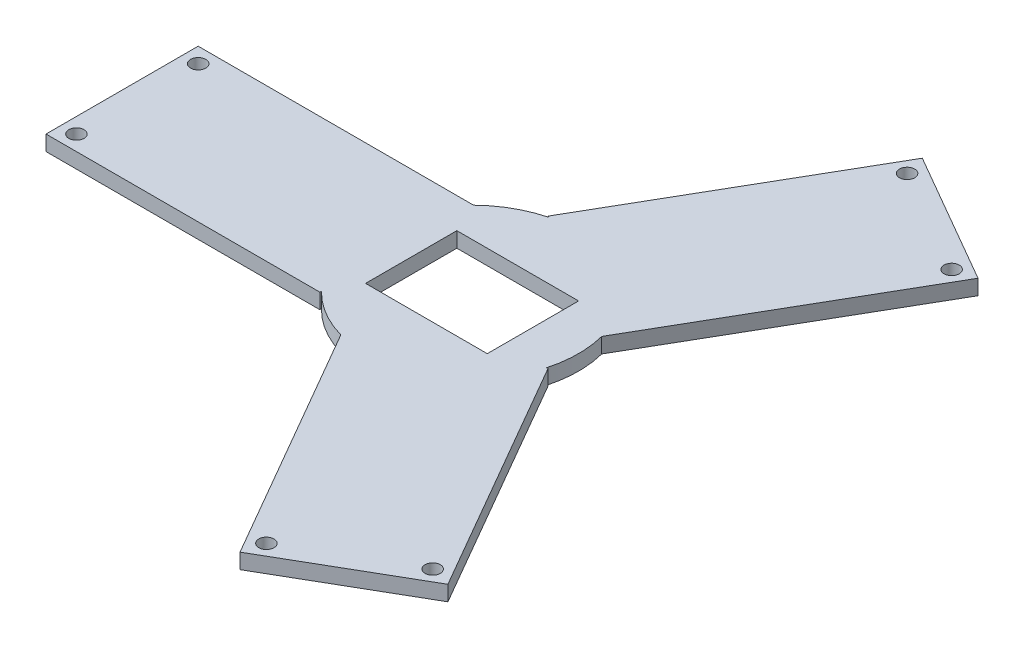
ISO-10303-21;
HEADER;
FILE_DESCRIPTION(('STEP AP214'),'2;1');
FILE_NAME('part.step','',(''),(''),'','','');
FILE_SCHEMA(('AUTOMOTIVE_DESIGN { 1 0 10303 214 1 1 1 1 }'));
ENDSEC;
DATA;
#1=APPLICATION_CONTEXT('core data for automotive mechanical design processes');
#2=APPLICATION_PROTOCOL_DEFINITION('international standard','automotive_design',2000,#1);
#3=PRODUCT_CONTEXT('',#1,'mechanical');
#4=PRODUCT('Part','Part','',(#3));
#5=PRODUCT_RELATED_PRODUCT_CATEGORY('part','',(#4));
#6=PRODUCT_DEFINITION_FORMATION('','',#4);
#7=PRODUCT_DEFINITION_CONTEXT('part definition',#1,'design');
#8=PRODUCT_DEFINITION('design','',#6,#7);
#9=PRODUCT_DEFINITION_SHAPE('','',#8);
#10=(LENGTH_UNIT() NAMED_UNIT(*) SI_UNIT(.MILLI.,.METRE.));
#11=(NAMED_UNIT(*) PLANE_ANGLE_UNIT() SI_UNIT($,.RADIAN.));
#12=(NAMED_UNIT(*) SI_UNIT($,.STERADIAN.) SOLID_ANGLE_UNIT());
#13=UNCERTAINTY_MEASURE_WITH_UNIT(LENGTH_MEASURE(1.E-05),#10,'distance_accuracy_value','');
#14=(GEOMETRIC_REPRESENTATION_CONTEXT(3) GLOBAL_UNCERTAINTY_ASSIGNED_CONTEXT((#13)) GLOBAL_UNIT_ASSIGNED_CONTEXT((#10,
#11,#12)) REPRESENTATION_CONTEXT('',''));
#15=CARTESIAN_POINT('',(0.,0.,0.));
#16=DIRECTION('',(0.,0.,1.));
#17=DIRECTION('',(1.,0.,0.));
#18=AXIS2_PLACEMENT_3D('',#15,#16,#17);
#19=CARTESIAN_POINT('',(-110.,5.,-20.000000000055));
#20=DIRECTION('',(0.,-1.,0.));
#21=DIRECTION('',(0.,0.,-1.));
#22=AXIS2_PLACEMENT_3D('',#19,#20,#21);
#23=CYLINDRICAL_SURFACE('',#22,2.5);
#24=CARTESIAN_POINT('',(-110.,5.,-20.000000000055));
#25=DIRECTION('',(0.,1.,0.));
#26=DIRECTION('',(0.,0.,1.));
#27=AXIS2_PLACEMENT_3D('',#24,#25,#26);
#28=CIRCLE('',#27,2.5);
#29=CARTESIAN_POINT('',(-110.,5.,-17.500000000055));
#30=VERTEX_POINT('',#29);
#31=EDGE_CURVE('E393',#30,#30,#28,.F.);
#32=ORIENTED_EDGE('',*,*,#31,.F.);
#33=EDGE_LOOP('',(#32));
#34=FACE_BOUND('',#33,.T.);
#35=CARTESIAN_POINT('',(-110.,0.,-20.000000000055));
#36=DIRECTION('',(0.,1.,0.));
#37=DIRECTION('',(0.,0.,1.));
#38=AXIS2_PLACEMENT_3D('',#35,#36,#37);
#39=CIRCLE('',#38,2.5);
#40=CARTESIAN_POINT('',(-110.,0.,-17.500000000055));
#41=VERTEX_POINT('',#40);
#42=EDGE_CURVE('E377',#41,#41,#39,.F.);
#43=ORIENTED_EDGE('',*,*,#42,.T.);
#44=EDGE_LOOP('',(#43));
#45=FACE_BOUND('',#44,.T.);
#46=ADVANCED_FACE('F190',(#34,#45),#23,.F.);
#47=CARTESIAN_POINT('',(-110.,5.,20.000000000055));
#48=DIRECTION('',(0.,-1.,0.));
#49=DIRECTION('',(0.,0.,-1.));
#50=AXIS2_PLACEMENT_3D('',#47,#48,#49);
#51=CYLINDRICAL_SURFACE('',#50,2.5);
#52=CARTESIAN_POINT('',(-110.,5.,20.000000000055));
#53=DIRECTION('',(0.,1.,0.));
#54=DIRECTION('',(0.,0.,1.));
#55=AXIS2_PLACEMENT_3D('',#52,#53,#54);
#56=CIRCLE('',#55,2.5);
#57=CARTESIAN_POINT('',(-110.,5.,22.500000000055));
#58=VERTEX_POINT('',#57);
#59=EDGE_CURVE('E389',#58,#58,#56,.T.);
#60=ORIENTED_EDGE('',*,*,#59,.T.);
#61=EDGE_LOOP('',(#60));
#62=FACE_BOUND('',#61,.T.);
#63=CARTESIAN_POINT('',(-110.,0.,20.000000000055));
#64=DIRECTION('',(0.,1.,0.));
#65=DIRECTION('',(0.,0.,1.));
#66=AXIS2_PLACEMENT_3D('',#63,#64,#65);
#67=CIRCLE('',#66,2.5);
#68=CARTESIAN_POINT('',(-110.,0.,22.500000000055));
#69=VERTEX_POINT('',#68);
#70=EDGE_CURVE('E415',#69,#69,#67,.T.);
#71=ORIENTED_EDGE('',*,*,#70,.F.);
#72=EDGE_LOOP('',(#71));
#73=FACE_BOUND('',#72,.T.);
#74=ADVANCED_FACE('F635',(#62,#73),#51,.F.);
#75=CARTESIAN_POINT('',(0.,5.,-24.9999999999607));
#76=DIRECTION('',(0.,0.,-1.));
#77=DIRECTION('',(-1.,0.,0.));
#78=AXIS2_PLACEMENT_3D('',#75,#76,#77);
#79=PLANE('',#78);
#80=DIRECTION('',(1.,0.,0.));
#81=VECTOR('',#80,1.);
#82=CARTESIAN_POINT('',(0.,0.,-24.9999999999607));
#83=LINE('',#82,#81);
#84=CARTESIAN_POINT('',(-115.,0.,-24.9999999999607));
#85=VERTEX_POINT('',#84);
#86=CARTESIAN_POINT('',(-24.4948974278719,0.,-24.9999999999607));
#87=VERTEX_POINT('',#86);
#88=EDGE_CURVE('E398',#85,#87,#83,.T.);
#89=ORIENTED_EDGE('',*,*,#88,.F.);
#90=DIRECTION('',(0.,-1.,0.));
#91=VECTOR('',#90,1.);
#92=CARTESIAN_POINT('',(-115.,5.,-24.9999999999607));
#93=LINE('',#92,#91);
#94=CARTESIAN_POINT('',(-115.,5.,-24.9999999999607));
#95=VERTEX_POINT('',#94);
#96=EDGE_CURVE('E200',#95,#85,#93,.T.);
#97=ORIENTED_EDGE('',*,*,#96,.F.);
#98=DIRECTION('',(1.,0.,0.));
#99=VECTOR('',#98,1.);
#100=CARTESIAN_POINT('',(0.,5.,-24.9999999999607));
#101=LINE('',#100,#99);
#102=CARTESIAN_POINT('',(-24.4948974278719,5.,-24.9999999999607));
#103=VERTEX_POINT('',#102);
#104=EDGE_CURVE('E372',#95,#103,#101,.T.);
#105=ORIENTED_EDGE('',*,*,#104,.T.);
#106=DIRECTION('',(0.,-1.,0.));
#107=VECTOR('',#106,1.);
#108=CARTESIAN_POINT('',(-24.4948974278719,5.,-24.9999999999607));
#109=LINE('',#108,#107);
#110=EDGE_CURVE('E12',#103,#87,#109,.T.);
#111=ORIENTED_EDGE('',*,*,#110,.T.);
#112=EDGE_LOOP('',(#89,#97,#105,#111));
#113=FACE_BOUND('',#112,.T.);
#114=ADVANCED_FACE('F632',(#113),#79,.T.);
#115=CARTESIAN_POINT('',(-115.,5.,0.));
#116=DIRECTION('',(-1.,0.,0.));
#117=DIRECTION('',(0.,0.,1.));
#118=AXIS2_PLACEMENT_3D('',#115,#116,#117);
#119=PLANE('',#118);
#120=DIRECTION('',(0.,0.,-1.));
#121=VECTOR('',#120,1.);
#122=CARTESIAN_POINT('',(-115.,0.,0.));
#123=LINE('',#122,#121);
#124=CARTESIAN_POINT('',(-115.,0.,25.000000000055));
#125=VERTEX_POINT('',#124);
#126=EDGE_CURVE('E402',#125,#85,#123,.T.);
#127=ORIENTED_EDGE('',*,*,#126,.F.);
#128=DIRECTION('',(0.,-1.,0.));
#129=VECTOR('',#128,1.);
#130=CARTESIAN_POINT('',(-115.,5.,25.000000000055));
#131=LINE('',#130,#129);
#132=CARTESIAN_POINT('',(-115.,5.,25.000000000055));
#133=VERTEX_POINT('',#132);
#134=EDGE_CURVE('E427',#133,#125,#131,.T.);
#135=ORIENTED_EDGE('',*,*,#134,.F.);
#136=DIRECTION('',(0.,0.,-1.));
#137=VECTOR('',#136,1.);
#138=CARTESIAN_POINT('',(-115.,5.,0.));
#139=LINE('',#138,#137);
#140=EDGE_CURVE('E376',#133,#95,#139,.T.);
#141=ORIENTED_EDGE('',*,*,#140,.T.);
#142=ORIENTED_EDGE('',*,*,#96,.T.);
#143=EDGE_LOOP('',(#127,#135,#141,#142));
#144=FACE_BOUND('',#143,.T.);
#145=ADVANCED_FACE('F629',(#144),#119,.T.);
#146=CARTESIAN_POINT('',(0.,5.,25.000000000055));
#147=DIRECTION('',(0.,0.,1.));
#148=DIRECTION('',(1.,0.,0.));
#149=AXIS2_PLACEMENT_3D('',#146,#147,#148);
#150=PLANE('',#149);
#151=DIRECTION('',(-1.,0.,0.));
#152=VECTOR('',#151,1.);
#153=CARTESIAN_POINT('',(0.,0.,25.000000000055));
#154=LINE('',#153,#152);
#155=CARTESIAN_POINT('',(-25.,0.,25.000000000055));
#156=VERTEX_POINT('',#155);
#157=EDGE_CURVE('E407',#156,#125,#154,.T.);
#158=ORIENTED_EDGE('',*,*,#157,.F.);
#159=DIRECTION('',(0.,-1.,0.));
#160=VECTOR('',#159,1.);
#161=CARTESIAN_POINT('',(-25.,5.,25.000000000055));
#162=LINE('',#161,#160);
#163=CARTESIAN_POINT('',(-25.,5.,25.000000000055));
#164=VERTEX_POINT('',#163);
#165=EDGE_CURVE('E424',#164,#156,#162,.T.);
#166=ORIENTED_EDGE('',*,*,#165,.F.);
#167=DIRECTION('',(-1.,0.,0.));
#168=VECTOR('',#167,1.);
#169=CARTESIAN_POINT('',(0.,5.,25.000000000055));
#170=LINE('',#169,#168);
#171=EDGE_CURVE('E381',#164,#133,#170,.T.);
#172=ORIENTED_EDGE('',*,*,#171,.T.);
#173=ORIENTED_EDGE('',*,*,#134,.T.);
#174=EDGE_LOOP('',(#158,#166,#172,#173));
#175=FACE_BOUND('',#174,.T.);
#176=ADVANCED_FACE('F624',(#175),#150,.T.);
#177=CARTESIAN_POINT('',(-24.744923458781,5.,-0.249974489722791));
#178=DIRECTION('',(0.99994897818343,0.,0.0101015360175433));
#179=DIRECTION('',(0.0101015360175433,0.,-0.99994897818343));
#180=AXIS2_PLACEMENT_3D('',#177,#178,#179);
#181=PLANE('',#180);
#182=DIRECTION('',(-0.0101015360175433,0.,0.99994897818343));
#183=VECTOR('',#182,1.);
#184=CARTESIAN_POINT('',(-24.744923458781,0.,-0.249974489722791));
#185=LINE('',#184,#183);
#186=CARTESIAN_POINT('',(-24.9949494896901,0.,24.5000510205151));
#187=VERTEX_POINT('',#186);
#188=EDGE_CURVE('E411',#187,#156,#185,.T.);
#189=ORIENTED_EDGE('',*,*,#188,.F.);
#190=DIRECTION('',(0.,-1.,0.));
#191=VECTOR('',#190,1.);
#192=CARTESIAN_POINT('',(-24.9949494896901,5.,24.5000510205151));
#193=LINE('',#192,#191);
#194=CARTESIAN_POINT('',(-24.9949494896901,5.,24.5000510205151));
#195=VERTEX_POINT('',#194);
#196=EDGE_CURVE('E397',#195,#187,#193,.T.);
#197=ORIENTED_EDGE('',*,*,#196,.F.);
#198=DIRECTION('',(-0.0101015360175433,0.,0.99994897818343));
#199=VECTOR('',#198,1.);
#200=CARTESIAN_POINT('',(-24.744923458781,5.,-0.249974489722791));
#201=LINE('',#200,#199);
#202=EDGE_CURVE('E385',#195,#164,#201,.T.);
#203=ORIENTED_EDGE('',*,*,#202,.T.);
#204=ORIENTED_EDGE('',*,*,#165,.T.);
#205=EDGE_LOOP('',(#189,#197,#203,#204));
#206=FACE_BOUND('',#205,.T.);
#207=ADVANCED_FACE('F621',(#206),#181,.T.);
#208=CARTESIAN_POINT('',(0.,0.,0.));
#209=DIRECTION('',(0.,1.,0.));
#210=DIRECTION('',(0.,0.,1.));
#211=AXIS2_PLACEMENT_3D('',#208,#209,#210);
#212=PLANE('',#211);
#213=DIRECTION('',(-1.,0.,0.));
#214=VECTOR('',#213,1.);
#215=CARTESIAN_POINT('',(20.,0.,-15.));
#216=LINE('',#215,#214);
#217=CARTESIAN_POINT('',(20.,0.,-15.));
#218=VERTEX_POINT('',#217);
#219=CARTESIAN_POINT('',(-20.,0.,-15.));
#220=VERTEX_POINT('',#219);
#221=EDGE_CURVE('E332',#218,#220,#216,.T.);
#222=ORIENTED_EDGE('',*,*,#221,.T.);
#223=DIRECTION('',(0.,0.,1.));
#224=VECTOR('',#223,1.);
#225=CARTESIAN_POINT('',(-20.,0.,15.));
#226=LINE('',#225,#224);
#227=CARTESIAN_POINT('',(-20.,0.,15.));
#228=VERTEX_POINT('',#227);
#229=EDGE_CURVE('E325',#220,#228,#226,.T.);
#230=ORIENTED_EDGE('',*,*,#229,.T.);
#231=DIRECTION('',(1.,0.,0.));
#232=VECTOR('',#231,1.);
#233=CARTESIAN_POINT('',(20.,0.,15.));
#234=LINE('',#233,#232);
#235=CARTESIAN_POINT('',(20.,0.,15.));
#236=VERTEX_POINT('',#235);
#237=EDGE_CURVE('E335',#228,#236,#234,.T.);
#238=ORIENTED_EDGE('',*,*,#237,.T.);
#239=DIRECTION('',(0.,0.,-1.));
#240=VECTOR('',#239,1.);
#241=CARTESIAN_POINT('',(20.,0.,15.));
#242=LINE('',#241,#240);
#243=EDGE_CURVE('E208',#236,#218,#242,.T.);
#244=ORIENTED_EDGE('',*,*,#243,.T.);
#245=EDGE_LOOP('',(#222,#230,#238,#244));
#246=FACE_BOUND('',#245,.T.);
#247=ORIENTED_EDGE('',*,*,#88,.T.);
#248=CARTESIAN_POINT('',(0.,0.,0.));
#249=DIRECTION('',(0.,1.,0.));
#250=DIRECTION('',(0.,0.,1.));
#251=AXIS2_PLACEMENT_3D('',#248,#249,#250);
#252=CIRCLE('',#251,35.);
#253=CARTESIAN_POINT('',(-8.72019183293593,0.,-33.896286734638));
#254=VERTEX_POINT('',#253);
#255=EDGE_CURVE('E529',#254,#87,#252,.T.);
#256=ORIENTED_EDGE('',*,*,#255,.F.);
#257=DIRECTION('',(0.86093044958637,0.,0.508722675900151));
#258=VECTOR('',#257,1.);
#259=CARTESIAN_POINT('',(12.5889459877885,0.,-21.3047450851444));
#260=LINE('',#259,#258);
#261=CARTESIAN_POINT('',(-9.15063509465858,0.,-34.1506350946385));
#262=VERTEX_POINT('',#261);
#263=EDGE_CURVE('E541',#262,#254,#260,.T.);
#264=ORIENTED_EDGE('',*,*,#263,.F.);
#265=DIRECTION('',(0.5,0.,-0.866025403784439));
#266=VECTOR('',#265,1.);
#267=CARTESIAN_POINT('',(-21.6506350946586,0.,-12.5000000000275));
#268=LINE('',#267,#266);
#269=CARTESIAN_POINT('',(35.8493649053414,0.,-112.092921435238));
#270=VERTEX_POINT('',#269);
#271=EDGE_CURVE('E537',#262,#270,#268,.T.);
#272=ORIENTED_EDGE('',*,*,#271,.T.);
#273=DIRECTION('',(0.866025403784439,0.,0.5));
#274=VECTOR('',#273,1.);
#275=CARTESIAN_POINT('',(57.5,0.,-99.5929214352105));
#276=LINE('',#275,#274);
#277=CARTESIAN_POINT('',(79.1506350945769,0.,-87.0929214352301));
#278=VERTEX_POINT('',#277);
#279=EDGE_CURVE('E533',#270,#278,#276,.T.);
#280=ORIENTED_EDGE('',*,*,#279,.T.);
#281=DIRECTION('',(0.5,0.,-0.866025403784439));
#282=VECTOR('',#281,1.);
#283=CARTESIAN_POINT('',(21.6506350945769,0.,12.4999999999803));
#284=LINE('',#283,#282);
#285=CARTESIAN_POINT('',(33.8980838085129,0.,-8.71320343565085));
#286=VERTEX_POINT('',#285);
#287=EDGE_CURVE('E527',#286,#278,#284,.T.);
#288=ORIENTED_EDGE('',*,*,#287,.F.);
#289=CARTESIAN_POINT('',(33.715141322626,0.,9.39623571412291));
#290=VERTEX_POINT('',#289);
#291=EDGE_CURVE('E366',#290,#286,#252,.T.);
#292=ORIENTED_EDGE('',*,*,#291,.F.);
#293=DIRECTION('',(0.871031985603914,0.,-0.49122630228328));
#294=VECTOR('',#293,1.);
#295=CARTESIAN_POINT('',(12.1559774709925,0.,21.5547195748672));
#296=LINE('',#295,#294);
#297=CARTESIAN_POINT('',(34.1506350946586,0.,9.15063509458348));
#298=VERTEX_POINT('',#297);
#299=EDGE_CURVE('E469',#290,#298,#296,.T.);
#300=ORIENTED_EDGE('',*,*,#299,.T.);
#301=DIRECTION('',(0.500000000000001,0.,0.866025403784438));
#302=VECTOR('',#301,1.);
#303=CARTESIAN_POINT('',(21.6506350946586,0.,-12.5000000000275));
#304=LINE('',#303,#302);
#305=CARTESIAN_POINT('',(79.1506350946587,0.,87.0929214351829));
#306=VERTEX_POINT('',#305);
#307=EDGE_CURVE('E465',#298,#306,#304,.T.);
#308=ORIENTED_EDGE('',*,*,#307,.T.);
#309=DIRECTION('',(-0.866025403784438,0.,0.5));
#310=VECTOR('',#309,1.);
#311=CARTESIAN_POINT('',(57.5000000000001,0.,99.5929214352104));
#312=LINE('',#311,#310);
#313=CARTESIAN_POINT('',(35.8493649054231,0.,112.092921435191));
#314=VERTEX_POINT('',#313);
#315=EDGE_CURVE('E461',#306,#314,#312,.T.);
#316=ORIENTED_EDGE('',*,*,#315,.T.);
#317=DIRECTION('',(0.5,0.,0.866025403784438));
#318=VECTOR('',#317,1.);
#319=CARTESIAN_POINT('',(-21.6506350945769,0.,12.4999999999803));
#320=LINE('',#319,#318);
#321=CARTESIAN_POINT('',(-9.40318638064095,0.,33.7132034356115));
#322=VERTEX_POINT('',#321);
#323=EDGE_CURVE('E457',#322,#314,#320,.T.);
#324=ORIENTED_EDGE('',*,*,#323,.F.);
#325=EDGE_CURVE('E528',#187,#322,#252,.T.);
#326=ORIENTED_EDGE('',*,*,#325,.F.);
#327=ORIENTED_EDGE('',*,*,#188,.T.);
#328=ORIENTED_EDGE('',*,*,#157,.T.);
#329=ORIENTED_EDGE('',*,*,#126,.T.);
#330=EDGE_LOOP('',(#247,#256,#264,#272,#280,#288,#292,#300,#308,#316,#324,#326,#327,#328,#329));
#331=FACE_BOUND('',#330,.T.);
#332=ORIENTED_EDGE('',*,*,#70,.T.);
#333=EDGE_LOOP('',(#332));
#334=FACE_BOUND('',#333,.T.);
#335=ORIENTED_EDGE('',*,*,#42,.F.);
#336=EDGE_LOOP('',(#335));
#337=FACE_BOUND('',#336,.T.);
#338=CARTESIAN_POINT('',(72.3205080757368,0.,-85.2627944162604));
#339=DIRECTION('',(0.,1.,0.));
#340=DIRECTION('',(0.,0.,1.));
#341=AXIS2_PLACEMENT_3D('',#338,#339,#340);
#342=CIRCLE('',#341,2.49999999999999);
#343=CARTESIAN_POINT('',(72.3205080757368,0.,-82.7627944162605));
#344=VERTEX_POINT('',#343);
#345=EDGE_CURVE('E498',#344,#344,#342,.F.);
#346=ORIENTED_EDGE('',*,*,#345,.F.);
#347=EDGE_LOOP('',(#346));
#348=FACE_BOUND('',#347,.T.);
#349=CARTESIAN_POINT('',(37.6794919242641,0.,-105.262794416316));
#350=DIRECTION('',(0.,1.,0.));
#351=DIRECTION('',(0.,0.,1.));
#352=AXIS2_PLACEMENT_3D('',#349,#350,#351);
#353=CIRCLE('',#352,2.5);
#354=CARTESIAN_POINT('',(37.6794919242641,0.,-102.762794416316));
#355=VERTEX_POINT('',#354);
#356=EDGE_CURVE('E545',#355,#355,#353,.T.);
#357=ORIENTED_EDGE('',*,*,#356,.T.);
#358=EDGE_LOOP('',(#357));
#359=FACE_BOUND('',#358,.T.);
#360=CARTESIAN_POINT('',(72.3205080757356,0.,85.2627944162614));
#361=DIRECTION('',(0.,1.,0.));
#362=DIRECTION('',(0.,0.,1.));
#363=AXIS2_PLACEMENT_3D('',#360,#361,#362);
#364=CIRCLE('',#363,2.49999999999999);
#365=CARTESIAN_POINT('',(72.3205080757356,0.,87.7627944162614));
#366=VERTEX_POINT('',#365);
#367=EDGE_CURVE('E473',#366,#366,#364,.T.);
#368=ORIENTED_EDGE('',*,*,#367,.T.);
#369=EDGE_LOOP('',(#368));
#370=FACE_BOUND('',#369,.T.);
#371=CARTESIAN_POINT('',(37.6794919242626,0.,105.262794416316));
#372=DIRECTION('',(0.,1.,0.));
#373=DIRECTION('',(0.,0.,1.));
#374=AXIS2_PLACEMENT_3D('',#371,#372,#373);
#375=CIRCLE('',#374,2.49999999999998);
#376=CARTESIAN_POINT('',(37.6794919242626,0.,107.762794416316));
#377=VERTEX_POINT('',#376);
#378=EDGE_CURVE('E436',#377,#377,#375,.F.);
#379=ORIENTED_EDGE('',*,*,#378,.F.);
#380=EDGE_LOOP('',(#379));
#381=FACE_BOUND('',#380,.T.);
#382=ADVANCED_FACE('F340',(#246,#331,#334,#337,#348,#359,#370,#381),#212,.F.);
#383=CARTESIAN_POINT('',(0.,5.,0.));
#384=DIRECTION('',(0.,1.,0.));
#385=DIRECTION('',(0.,0.,1.));
#386=AXIS2_PLACEMENT_3D('',#383,#384,#385);
#387=PLANE('',#386);
#388=DIRECTION('',(0.,0.,1.));
#389=VECTOR('',#388,1.);
#390=CARTESIAN_POINT('',(-20.,5.,15.));
#391=LINE('',#390,#389);
#392=CARTESIAN_POINT('',(-20.,5.,-15.));
#393=VERTEX_POINT('',#392);
#394=CARTESIAN_POINT('',(-20.,5.,15.));
#395=VERTEX_POINT('',#394);
#396=EDGE_CURVE('E216',#393,#395,#391,.T.);
#397=ORIENTED_EDGE('',*,*,#396,.F.);
#398=DIRECTION('',(-1.,0.,0.));
#399=VECTOR('',#398,1.);
#400=CARTESIAN_POINT('',(20.,5.,-15.));
#401=LINE('',#400,#399);
#402=CARTESIAN_POINT('',(20.,5.,-15.));
#403=VERTEX_POINT('',#402);
#404=EDGE_CURVE('E344',#403,#393,#401,.T.);
#405=ORIENTED_EDGE('',*,*,#404,.F.);
#406=DIRECTION('',(0.,0.,-1.));
#407=VECTOR('',#406,1.);
#408=CARTESIAN_POINT('',(20.,5.,15.));
#409=LINE('',#408,#407);
#410=CARTESIAN_POINT('',(20.,5.,15.));
#411=VERTEX_POINT('',#410);
#412=EDGE_CURVE('E348',#411,#403,#409,.T.);
#413=ORIENTED_EDGE('',*,*,#412,.F.);
#414=DIRECTION('',(1.,0.,0.));
#415=VECTOR('',#414,1.);
#416=CARTESIAN_POINT('',(20.,5.,15.));
#417=LINE('',#416,#415);
#418=EDGE_CURVE('E357',#395,#411,#417,.T.);
#419=ORIENTED_EDGE('',*,*,#418,.F.);
#420=EDGE_LOOP('',(#397,#405,#413,#419));
#421=FACE_BOUND('',#420,.T.);
#422=ORIENTED_EDGE('',*,*,#202,.F.);
#423=CARTESIAN_POINT('',(0.,5.,0.));
#424=DIRECTION('',(0.,1.,0.));
#425=DIRECTION('',(0.,0.,1.));
#426=AXIS2_PLACEMENT_3D('',#423,#424,#425);
#427=CIRCLE('',#426,35.);
#428=CARTESIAN_POINT('',(-9.40318638064095,5.,33.7132034356115));
#429=VERTEX_POINT('',#428);
#430=EDGE_CURVE('E499',#195,#429,#427,.T.);
#431=ORIENTED_EDGE('',*,*,#430,.T.);
#432=DIRECTION('',(0.5,0.,0.866025403784438));
#433=VECTOR('',#432,1.);
#434=CARTESIAN_POINT('',(-21.6506350945769,5.,12.4999999999803));
#435=LINE('',#434,#433);
#436=CARTESIAN_POINT('',(35.8493649054231,5.,112.092921435191));
#437=VERTEX_POINT('',#436);
#438=EDGE_CURVE('E432',#429,#437,#435,.T.);
#439=ORIENTED_EDGE('',*,*,#438,.T.);
#440=DIRECTION('',(-0.866025403784438,0.,0.5));
#441=VECTOR('',#440,1.);
#442=CARTESIAN_POINT('',(57.5000000000001,5.,99.5929214352104));
#443=LINE('',#442,#441);
#444=CARTESIAN_POINT('',(79.1506350946587,5.,87.0929214351829));
#445=VERTEX_POINT('',#444);
#446=EDGE_CURVE('E435',#445,#437,#443,.T.);
#447=ORIENTED_EDGE('',*,*,#446,.F.);
#448=DIRECTION('',(0.500000000000001,0.,0.866025403784438));
#449=VECTOR('',#448,1.);
#450=CARTESIAN_POINT('',(21.6506350946586,5.,-12.5000000000275));
#451=LINE('',#450,#449);
#452=CARTESIAN_POINT('',(34.1506350946586,5.,9.15063509458348));
#453=VERTEX_POINT('',#452);
#454=EDGE_CURVE('E440',#453,#445,#451,.T.);
#455=ORIENTED_EDGE('',*,*,#454,.F.);
#456=DIRECTION('',(0.871031985603914,0.,-0.49122630228328));
#457=VECTOR('',#456,1.);
#458=CARTESIAN_POINT('',(12.1559774709925,5.,21.5547195748672));
#459=LINE('',#458,#457);
#460=CARTESIAN_POINT('',(33.715141322626,5.,9.39623571412291));
#461=VERTEX_POINT('',#460);
#462=EDGE_CURVE('E444',#461,#453,#459,.T.);
#463=ORIENTED_EDGE('',*,*,#462,.F.);
#464=CARTESIAN_POINT('',(33.8980838085129,5.,-8.71320343565085));
#465=VERTEX_POINT('',#464);
#466=EDGE_CURVE('E493',#461,#465,#427,.T.);
#467=ORIENTED_EDGE('',*,*,#466,.T.);
#468=DIRECTION('',(0.5,0.,-0.866025403784439));
#469=VECTOR('',#468,1.);
#470=CARTESIAN_POINT('',(21.6506350945769,5.,12.4999999999803));
#471=LINE('',#470,#469);
#472=CARTESIAN_POINT('',(79.1506350945769,5.,-87.0929214352301));
#473=VERTEX_POINT('',#472);
#474=EDGE_CURVE('E497',#465,#473,#471,.T.);
#475=ORIENTED_EDGE('',*,*,#474,.T.);
#476=DIRECTION('',(0.866025403784439,0.,0.5));
#477=VECTOR('',#476,1.);
#478=CARTESIAN_POINT('',(57.5,5.,-99.5929214352105));
#479=LINE('',#478,#477);
#480=CARTESIAN_POINT('',(35.8493649053414,5.,-112.092921435238));
#481=VERTEX_POINT('',#480);
#482=EDGE_CURVE('E503',#481,#473,#479,.T.);
#483=ORIENTED_EDGE('',*,*,#482,.F.);
#484=DIRECTION('',(0.5,0.,-0.866025403784439));
#485=VECTOR('',#484,1.);
#486=CARTESIAN_POINT('',(-21.6506350946586,5.,-12.5000000000275));
#487=LINE('',#486,#485);
#488=CARTESIAN_POINT('',(-9.15063509465858,5.,-34.1506350946385));
#489=VERTEX_POINT('',#488);
#490=EDGE_CURVE('E507',#489,#481,#487,.T.);
#491=ORIENTED_EDGE('',*,*,#490,.F.);
#492=DIRECTION('',(0.86093044958637,0.,0.508722675900151));
#493=VECTOR('',#492,1.);
#494=CARTESIAN_POINT('',(12.5889459877885,5.,-21.3047450851444));
#495=LINE('',#494,#493);
#496=CARTESIAN_POINT('',(-8.72019183293593,5.,-33.896286734638));
#497=VERTEX_POINT('',#496);
#498=EDGE_CURVE('E511',#489,#497,#495,.T.);
#499=ORIENTED_EDGE('',*,*,#498,.T.);
#500=EDGE_CURVE('E500',#497,#103,#427,.T.);
#501=ORIENTED_EDGE('',*,*,#500,.T.);
#502=ORIENTED_EDGE('',*,*,#104,.F.);
#503=ORIENTED_EDGE('',*,*,#140,.F.);
#504=ORIENTED_EDGE('',*,*,#171,.F.);
#505=EDGE_LOOP('',(#422,#431,#439,#447,#455,#463,#467,#475,#483,#491,#499,#501,#502,#503,#504));
#506=FACE_BOUND('',#505,.T.);
#507=ORIENTED_EDGE('',*,*,#59,.F.);
#508=EDGE_LOOP('',(#507));
#509=FACE_BOUND('',#508,.T.);
#510=ORIENTED_EDGE('',*,*,#31,.T.);
#511=EDGE_LOOP('',(#510));
#512=FACE_BOUND('',#511,.T.);
#513=CARTESIAN_POINT('',(37.6794919242641,5.,-105.262794416316));
#514=DIRECTION('',(0.,1.,0.));
#515=DIRECTION('',(0.,0.,1.));
#516=AXIS2_PLACEMENT_3D('',#513,#514,#515);
#517=CIRCLE('',#516,2.5);
#518=CARTESIAN_POINT('',(37.6794919242641,5.,-102.762794416316));
#519=VERTEX_POINT('',#518);
#520=EDGE_CURVE('E515',#519,#519,#517,.T.);
#521=ORIENTED_EDGE('',*,*,#520,.F.);
#522=EDGE_LOOP('',(#521));
#523=FACE_BOUND('',#522,.T.);
#524=CARTESIAN_POINT('',(72.3205080757368,5.,-85.2627944162604));
#525=DIRECTION('',(0.,1.,0.));
#526=DIRECTION('',(0.,0.,1.));
#527=AXIS2_PLACEMENT_3D('',#524,#525,#526);
#528=CIRCLE('',#527,2.49999999999999);
#529=CARTESIAN_POINT('',(72.3205080757368,5.,-82.7627944162605));
#530=VERTEX_POINT('',#529);
#531=EDGE_CURVE('E519',#530,#530,#528,.F.);
#532=ORIENTED_EDGE('',*,*,#531,.T.);
#533=EDGE_LOOP('',(#532));
#534=FACE_BOUND('',#533,.T.);
#535=CARTESIAN_POINT('',(72.3205080757356,5.,85.2627944162614));
#536=DIRECTION('',(0.,1.,0.));
#537=DIRECTION('',(0.,0.,1.));
#538=AXIS2_PLACEMENT_3D('',#535,#536,#537);
#539=CIRCLE('',#538,2.49999999999999);
#540=CARTESIAN_POINT('',(72.3205080757356,5.,87.7627944162614));
#541=VERTEX_POINT('',#540);
#542=EDGE_CURVE('E448',#541,#541,#539,.T.);
#543=ORIENTED_EDGE('',*,*,#542,.F.);
#544=EDGE_LOOP('',(#543));
#545=FACE_BOUND('',#544,.T.);
#546=CARTESIAN_POINT('',(37.6794919242626,5.,105.262794416316));
#547=DIRECTION('',(0.,1.,0.));
#548=DIRECTION('',(0.,0.,1.));
#549=AXIS2_PLACEMENT_3D('',#546,#547,#548);
#550=CIRCLE('',#549,2.49999999999998);
#551=CARTESIAN_POINT('',(37.6794919242626,5.,107.762794416316));
#552=VERTEX_POINT('',#551);
#553=EDGE_CURVE('E452',#552,#552,#550,.F.);
#554=ORIENTED_EDGE('',*,*,#553,.T.);
#555=EDGE_LOOP('',(#554));
#556=FACE_BOUND('',#555,.T.);
#557=ADVANCED_FACE('F582',(#421,#506,#509,#512,#523,#534,#545,#556),#387,.T.);
#558=CARTESIAN_POINT('',(37.6794919242626,5.,105.262794416316));
#559=DIRECTION('',(0.,-1.,0.));
#560=DIRECTION('',(0.,0.,-1.));
#561=AXIS2_PLACEMENT_3D('',#558,#559,#560);
#562=CYLINDRICAL_SURFACE('',#561,2.49999999999998);
#563=ORIENTED_EDGE('',*,*,#553,.F.);
#564=EDGE_LOOP('',(#563));
#565=FACE_BOUND('',#564,.T.);
#566=ORIENTED_EDGE('',*,*,#378,.T.);
#567=EDGE_LOOP('',(#566));
#568=FACE_BOUND('',#567,.T.);
#569=ADVANCED_FACE('F683',(#565,#568),#562,.F.);
#570=CARTESIAN_POINT('',(72.3205080757356,5.,85.2627944162614));
#571=DIRECTION('',(0.,-1.,0.));
#572=DIRECTION('',(0.,0.,-1.));
#573=AXIS2_PLACEMENT_3D('',#570,#571,#572);
#574=CYLINDRICAL_SURFACE('',#573,2.49999999999999);
#575=ORIENTED_EDGE('',*,*,#542,.T.);
#576=EDGE_LOOP('',(#575));
#577=FACE_BOUND('',#576,.T.);
#578=ORIENTED_EDGE('',*,*,#367,.F.);
#579=EDGE_LOOP('',(#578));
#580=FACE_BOUND('',#579,.T.);
#581=ADVANCED_FACE('F692',(#577,#580),#574,.F.);
#582=CARTESIAN_POINT('',(21.6506350946586,5.,-12.5000000000275));
#583=DIRECTION('',(0.866025403784438,0.,-0.500000000000001));
#584=DIRECTION('',(-0.500000000000001,0.,-0.866025403784438));
#585=AXIS2_PLACEMENT_3D('',#582,#583,#584);
#586=PLANE('',#585);
#587=ORIENTED_EDGE('',*,*,#307,.F.);
#588=DIRECTION('',(0.,-1.,0.));
#589=VECTOR('',#588,1.);
#590=CARTESIAN_POINT('',(34.1506350946586,5.,9.15063509458348));
#591=LINE('',#590,#589);
#592=EDGE_CURVE('E482',#453,#298,#591,.T.);
#593=ORIENTED_EDGE('',*,*,#592,.F.);
#594=ORIENTED_EDGE('',*,*,#454,.T.);
#595=DIRECTION('',(0.,-1.,0.));
#596=VECTOR('',#595,1.);
#597=CARTESIAN_POINT('',(79.1506350946587,5.,87.0929214351829));
#598=LINE('',#597,#596);
#599=EDGE_CURVE('E485',#445,#306,#598,.T.);
#600=ORIENTED_EDGE('',*,*,#599,.T.);
#601=EDGE_LOOP('',(#587,#593,#594,#600));
#602=FACE_BOUND('',#601,.T.);
#603=ADVANCED_FACE('F614',(#602),#586,.T.);
#604=CARTESIAN_POINT('',(12.1559774709925,5.,21.5547195748672));
#605=DIRECTION('',(-0.49122630228328,0.,-0.871031985603913));
#606=DIRECTION('',(-0.871031985603913,0.,0.49122630228328));
#607=AXIS2_PLACEMENT_3D('',#604,#605,#606);
#608=PLANE('',#607);
#609=ORIENTED_EDGE('',*,*,#299,.F.);
#610=DIRECTION('',(0.,-1.,0.));
#611=VECTOR('',#610,1.);
#612=CARTESIAN_POINT('',(33.715141322626,5.,9.39623571412291));
#613=LINE('',#612,#611);
#614=EDGE_CURVE('E456',#461,#290,#613,.T.);
#615=ORIENTED_EDGE('',*,*,#614,.F.);
#616=ORIENTED_EDGE('',*,*,#462,.T.);
#617=ORIENTED_EDGE('',*,*,#592,.T.);
#618=EDGE_LOOP('',(#609,#615,#616,#617));
#619=FACE_BOUND('',#618,.T.);
#620=ADVANCED_FACE('F616',(#619),#608,.T.);
#621=CARTESIAN_POINT('',(21.6506350945769,5.,12.4999999999803));
#622=DIRECTION('',(-0.866025403784439,0.,-0.5));
#623=DIRECTION('',(-0.5,0.,0.866025403784439));
#624=AXIS2_PLACEMENT_3D('',#621,#622,#623);
#625=PLANE('',#624);
#626=ORIENTED_EDGE('',*,*,#287,.T.);
#627=DIRECTION('',(0.,-1.,0.));
#628=VECTOR('',#627,1.);
#629=CARTESIAN_POINT('',(79.1506350945769,5.,-87.0929214352301));
#630=LINE('',#629,#628);
#631=EDGE_CURVE('E559',#473,#278,#630,.T.);
#632=ORIENTED_EDGE('',*,*,#631,.F.);
#633=ORIENTED_EDGE('',*,*,#474,.F.);
#634=DIRECTION('',(0.,-1.,0.));
#635=VECTOR('',#634,1.);
#636=CARTESIAN_POINT('',(33.8980838085129,5.,-8.71320343565085));
#637=LINE('',#636,#635);
#638=EDGE_CURVE('E194',#465,#286,#637,.T.);
#639=ORIENTED_EDGE('',*,*,#638,.T.);
#640=EDGE_LOOP('',(#626,#632,#633,#639));
#641=FACE_BOUND('',#640,.T.);
#642=ADVANCED_FACE('F192',(#641),#625,.F.);
#643=CARTESIAN_POINT('',(57.5,5.,-99.5929214352105));
#644=DIRECTION('',(0.5,0.,-0.866025403784439));
#645=DIRECTION('',(-0.866025403784439,0.,-0.5));
#646=AXIS2_PLACEMENT_3D('',#643,#644,#645);
#647=PLANE('',#646);
#648=ORIENTED_EDGE('',*,*,#279,.F.);
#649=DIRECTION('',(0.,-1.,0.));
#650=VECTOR('',#649,1.);
#651=CARTESIAN_POINT('',(35.8493649053414,5.,-112.092921435238));
#652=LINE('',#651,#650);
#653=EDGE_CURVE('E557',#481,#270,#652,.T.);
#654=ORIENTED_EDGE('',*,*,#653,.F.);
#655=ORIENTED_EDGE('',*,*,#482,.T.);
#656=ORIENTED_EDGE('',*,*,#631,.T.);
#657=EDGE_LOOP('',(#648,#654,#655,#656));
#658=FACE_BOUND('',#657,.T.);
#659=ADVANCED_FACE('F576',(#658),#647,.T.);
#660=CARTESIAN_POINT('',(37.6794919242641,5.,-105.262794416316));
#661=DIRECTION('',(0.,-1.,0.));
#662=DIRECTION('',(0.,0.,-1.));
#663=AXIS2_PLACEMENT_3D('',#660,#661,#662);
#664=CYLINDRICAL_SURFACE('',#663,2.5);
#665=ORIENTED_EDGE('',*,*,#520,.T.);
#666=EDGE_LOOP('',(#665));
#667=FACE_BOUND('',#666,.T.);
#668=ORIENTED_EDGE('',*,*,#356,.F.);
#669=EDGE_LOOP('',(#668));
#670=FACE_BOUND('',#669,.T.);
#671=ADVANCED_FACE('F723',(#667,#670),#664,.F.);
#672=CARTESIAN_POINT('',(72.3205080757368,5.,-85.2627944162604));
#673=DIRECTION('',(0.,-1.,0.));
#674=DIRECTION('',(0.,0.,-1.));
#675=AXIS2_PLACEMENT_3D('',#672,#673,#674);
#676=CYLINDRICAL_SURFACE('',#675,2.49999999999999);
#677=ORIENTED_EDGE('',*,*,#531,.F.);
#678=EDGE_LOOP('',(#677));
#679=FACE_BOUND('',#678,.T.);
#680=ORIENTED_EDGE('',*,*,#345,.T.);
#681=EDGE_LOOP('',(#680));
#682=FACE_BOUND('',#681,.T.);
#683=ADVANCED_FACE('F729',(#679,#682),#676,.F.);
#684=CARTESIAN_POINT('',(-21.6506350946586,5.,-12.5000000000275));
#685=DIRECTION('',(-0.866025403784439,0.,-0.5));
#686=DIRECTION('',(-0.5,0.,0.866025403784439));
#687=AXIS2_PLACEMENT_3D('',#684,#685,#686);
#688=PLANE('',#687);
#689=ORIENTED_EDGE('',*,*,#271,.F.);
#690=DIRECTION('',(0.,-1.,0.));
#691=VECTOR('',#690,1.);
#692=CARTESIAN_POINT('',(-9.15063509465858,5.,-34.1506350946385));
#693=LINE('',#692,#691);
#694=EDGE_CURVE('E554',#489,#262,#693,.T.);
#695=ORIENTED_EDGE('',*,*,#694,.F.);
#696=ORIENTED_EDGE('',*,*,#490,.T.);
#697=ORIENTED_EDGE('',*,*,#653,.T.);
#698=EDGE_LOOP('',(#689,#695,#696,#697));
#699=FACE_BOUND('',#698,.T.);
#700=ADVANCED_FACE('F584',(#699),#688,.T.);
#701=CARTESIAN_POINT('',(57.5000000000001,5.,99.5929214352104));
#702=DIRECTION('',(0.5,0.,0.866025403784438));
#703=DIRECTION('',(0.866025403784438,0.,-0.5));
#704=AXIS2_PLACEMENT_3D('',#701,#702,#703);
#705=PLANE('',#704);
#706=ORIENTED_EDGE('',*,*,#315,.F.);
#707=ORIENTED_EDGE('',*,*,#599,.F.);
#708=ORIENTED_EDGE('',*,*,#446,.T.);
#709=DIRECTION('',(0.,-1.,0.));
#710=VECTOR('',#709,1.);
#711=CARTESIAN_POINT('',(35.8493649054231,5.,112.092921435191));
#712=LINE('',#711,#710);
#713=EDGE_CURVE('E488',#437,#314,#712,.T.);
#714=ORIENTED_EDGE('',*,*,#713,.T.);
#715=EDGE_LOOP('',(#706,#707,#708,#714));
#716=FACE_BOUND('',#715,.T.);
#717=ADVANCED_FACE('F609',(#716),#705,.T.);
#718=CARTESIAN_POINT('',(0.,5.,0.));
#719=DIRECTION('',(0.,-1.,0.));
#720=DIRECTION('',(0.,0.,-1.));
#721=AXIS2_PLACEMENT_3D('',#718,#719,#720);
#722=CYLINDRICAL_SURFACE('',#721,35.);
#723=ORIENTED_EDGE('',*,*,#291,.T.);
#724=ORIENTED_EDGE('',*,*,#638,.F.);
#725=ORIENTED_EDGE('',*,*,#466,.F.);
#726=ORIENTED_EDGE('',*,*,#614,.T.);
#727=EDGE_LOOP('',(#723,#724,#725,#726));
#728=FACE_BOUND('',#727,.T.);
#729=ADVANCED_FACE('F571',(#728),#722,.T.);
#730=CARTESIAN_POINT('',(12.5889459877885,5.,-21.3047450851444));
#731=DIRECTION('',(0.508722675900151,0.,-0.86093044958637));
#732=DIRECTION('',(-0.86093044958637,0.,-0.508722675900151));
#733=AXIS2_PLACEMENT_3D('',#730,#731,#732);
#734=PLANE('',#733);
#735=ORIENTED_EDGE('',*,*,#263,.T.);
#736=DIRECTION('',(0.,-1.,0.));
#737=VECTOR('',#736,1.);
#738=CARTESIAN_POINT('',(-8.72019183293593,5.,-33.896286734638));
#739=LINE('',#738,#737);
#740=EDGE_CURVE('E523',#497,#254,#739,.T.);
#741=ORIENTED_EDGE('',*,*,#740,.F.);
#742=ORIENTED_EDGE('',*,*,#498,.F.);
#743=ORIENTED_EDGE('',*,*,#694,.T.);
#744=EDGE_LOOP('',(#735,#741,#742,#743));
#745=FACE_BOUND('',#744,.T.);
#746=ADVANCED_FACE('F587',(#745),#734,.F.);
#747=CARTESIAN_POINT('',(-21.6506350945769,5.,12.4999999999803));
#748=DIRECTION('',(0.866025403784438,0.,-0.5));
#749=DIRECTION('',(-0.5,0.,-0.866025403784438));
#750=AXIS2_PLACEMENT_3D('',#747,#748,#749);
#751=PLANE('',#750);
#752=ORIENTED_EDGE('',*,*,#323,.T.);
#753=ORIENTED_EDGE('',*,*,#713,.F.);
#754=ORIENTED_EDGE('',*,*,#438,.F.);
#755=DIRECTION('',(0.,-1.,0.));
#756=VECTOR('',#755,1.);
#757=CARTESIAN_POINT('',(-9.40318638064095,5.,33.7132034356115));
#758=LINE('',#757,#756);
#759=EDGE_CURVE('E403',#429,#322,#758,.T.);
#760=ORIENTED_EDGE('',*,*,#759,.T.);
#761=EDGE_LOOP('',(#752,#753,#754,#760));
#762=FACE_BOUND('',#761,.T.);
#763=ADVANCED_FACE('F604',(#762),#751,.F.);
#764=ORIENTED_EDGE('',*,*,#325,.T.);
#765=ORIENTED_EDGE('',*,*,#759,.F.);
#766=ORIENTED_EDGE('',*,*,#430,.F.);
#767=ORIENTED_EDGE('',*,*,#196,.T.);
#768=EDGE_LOOP('',(#764,#765,#766,#767));
#769=FACE_BOUND('',#768,.T.);
#770=ADVANCED_FACE('F757',(#769),#722,.T.);
#771=ORIENTED_EDGE('',*,*,#255,.T.);
#772=ORIENTED_EDGE('',*,*,#110,.F.);
#773=ORIENTED_EDGE('',*,*,#500,.F.);
#774=ORIENTED_EDGE('',*,*,#740,.T.);
#775=EDGE_LOOP('',(#771,#772,#773,#774));
#776=FACE_BOUND('',#775,.T.);
#777=ADVANCED_FACE('F593',(#776),#722,.T.);
#778=CARTESIAN_POINT('',(-20.,0.,15.));
#779=DIRECTION('',(-1.,0.,0.));
#780=DIRECTION('',(0.,0.,1.));
#781=AXIS2_PLACEMENT_3D('',#778,#779,#780);
#782=PLANE('',#781);
#783=ORIENTED_EDGE('',*,*,#396,.T.);
#784=DIRECTION('',(0.,1.,0.));
#785=VECTOR('',#784,1.);
#786=CARTESIAN_POINT('',(-20.,0.,15.));
#787=LINE('',#786,#785);
#788=EDGE_CURVE('E321',#228,#395,#787,.T.);
#789=ORIENTED_EDGE('',*,*,#788,.F.);
#790=ORIENTED_EDGE('',*,*,#229,.F.);
#791=DIRECTION('',(0.,1.,0.));
#792=VECTOR('',#791,1.);
#793=CARTESIAN_POINT('',(-20.,0.,-15.));
#794=LINE('',#793,#792);
#795=EDGE_CURVE('E363',#220,#393,#794,.T.);
#796=ORIENTED_EDGE('',*,*,#795,.T.);
#797=EDGE_LOOP('',(#783,#789,#790,#796));
#798=FACE_BOUND('',#797,.T.);
#799=ADVANCED_FACE('F323',(#798),#782,.F.);
#800=CARTESIAN_POINT('',(20.,0.,-15.));
#801=DIRECTION('',(0.,0.,-1.));
#802=DIRECTION('',(-1.,0.,0.));
#803=AXIS2_PLACEMENT_3D('',#800,#801,#802);
#804=PLANE('',#803);
#805=ORIENTED_EDGE('',*,*,#404,.T.);
#806=ORIENTED_EDGE('',*,*,#795,.F.);
#807=ORIENTED_EDGE('',*,*,#221,.F.);
#808=DIRECTION('',(0.,1.,0.));
#809=VECTOR('',#808,1.);
#810=CARTESIAN_POINT('',(20.,0.,-15.));
#811=LINE('',#810,#809);
#812=EDGE_CURVE('E367',#218,#403,#811,.T.);
#813=ORIENTED_EDGE('',*,*,#812,.T.);
#814=EDGE_LOOP('',(#805,#806,#807,#813));
#815=FACE_BOUND('',#814,.T.);
#816=ADVANCED_FACE('F783',(#815),#804,.F.);
#817=CARTESIAN_POINT('',(20.,0.,15.));
#818=DIRECTION('',(1.,0.,0.));
#819=DIRECTION('',(0.,0.,-1.));
#820=AXIS2_PLACEMENT_3D('',#817,#818,#819);
#821=PLANE('',#820);
#822=ORIENTED_EDGE('',*,*,#412,.T.);
#823=ORIENTED_EDGE('',*,*,#812,.F.);
#824=ORIENTED_EDGE('',*,*,#243,.F.);
#825=DIRECTION('',(0.,1.,0.));
#826=VECTOR('',#825,1.);
#827=CARTESIAN_POINT('',(20.,0.,15.));
#828=LINE('',#827,#826);
#829=EDGE_CURVE('E331',#236,#411,#828,.T.);
#830=ORIENTED_EDGE('',*,*,#829,.T.);
#831=EDGE_LOOP('',(#822,#823,#824,#830));
#832=FACE_BOUND('',#831,.T.);
#833=ADVANCED_FACE('F789',(#832),#821,.F.);
#834=CARTESIAN_POINT('',(20.,0.,15.));
#835=DIRECTION('',(0.,0.,1.));
#836=DIRECTION('',(1.,0.,0.));
#837=AXIS2_PLACEMENT_3D('',#834,#835,#836);
#838=PLANE('',#837);
#839=ORIENTED_EDGE('',*,*,#418,.T.);
#840=ORIENTED_EDGE('',*,*,#829,.F.);
#841=ORIENTED_EDGE('',*,*,#237,.F.);
#842=ORIENTED_EDGE('',*,*,#788,.T.);
#843=EDGE_LOOP('',(#839,#840,#841,#842));
#844=FACE_BOUND('',#843,.T.);
#845=ADVANCED_FACE('F336',(#844),#838,.F.);
#846=CLOSED_SHELL('',(#46,#74,#114,#145,#176,#207,#382,#557,#569,#581,#603,#620,#642,#659,#671,
#683,#700,#717,#729,#746,#763,#770,#777,#799,#816,#833,#845));
#847=MANIFOLD_SOLID_BREP('B2',#846);
#848=ADVANCED_BREP_SHAPE_REPRESENTATION('',(#18,#847),#14);
#849=SHAPE_DEFINITION_REPRESENTATION(#9,#848);
ENDSEC;
END-ISO-10303-21;
